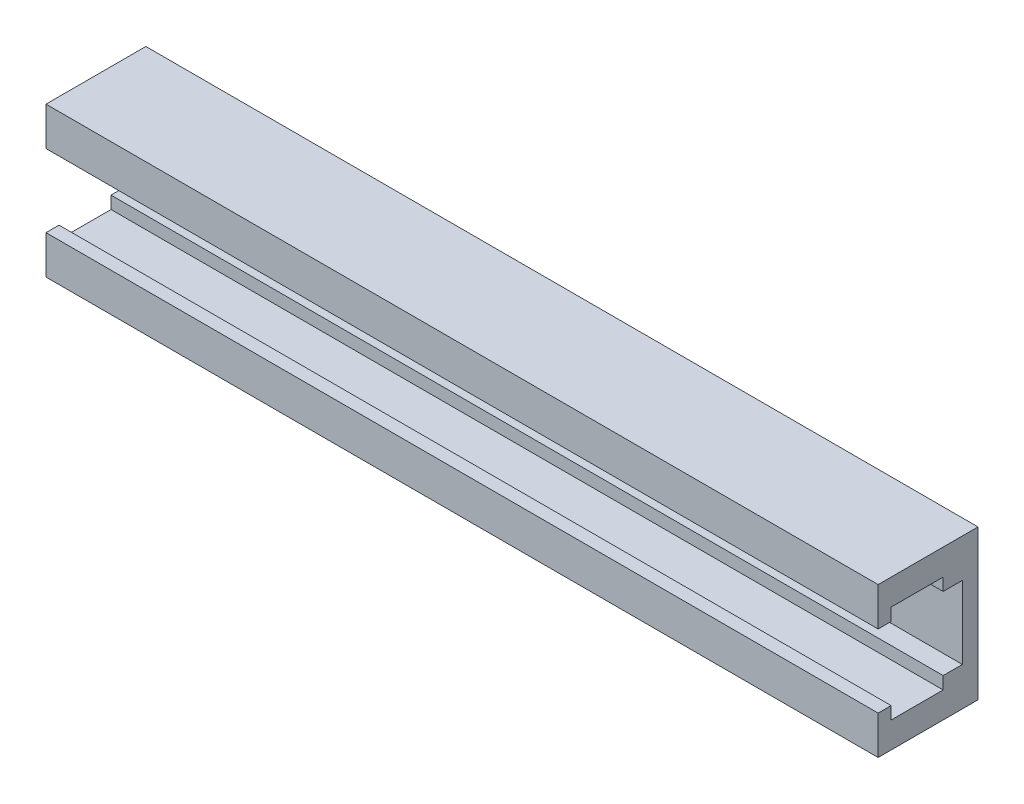
ISO-10303-21;
HEADER;
FILE_DESCRIPTION(('STEP AP214'),'2;1');
FILE_NAME('part.step','',(''),(''),'','','');
FILE_SCHEMA(('AUTOMOTIVE_DESIGN { 1 0 10303 214 1 1 1 1 }'));
ENDSEC;
DATA;
#1=APPLICATION_CONTEXT('core data for automotive mechanical design processes');
#2=APPLICATION_PROTOCOL_DEFINITION('international standard','automotive_design',2000,#1);
#3=PRODUCT_CONTEXT('',#1,'mechanical');
#4=PRODUCT('Part','Part','',(#3));
#5=PRODUCT_RELATED_PRODUCT_CATEGORY('part','',(#4));
#6=PRODUCT_DEFINITION_FORMATION('','',#4);
#7=PRODUCT_DEFINITION_CONTEXT('part definition',#1,'design');
#8=PRODUCT_DEFINITION('design','',#6,#7);
#9=PRODUCT_DEFINITION_SHAPE('','',#8);
#10=(LENGTH_UNIT() NAMED_UNIT(*) SI_UNIT(.MILLI.,.METRE.));
#11=(NAMED_UNIT(*) PLANE_ANGLE_UNIT() SI_UNIT($,.RADIAN.));
#12=(NAMED_UNIT(*) SI_UNIT($,.STERADIAN.) SOLID_ANGLE_UNIT());
#13=UNCERTAINTY_MEASURE_WITH_UNIT(LENGTH_MEASURE(1.E-05),#10,'distance_accuracy_value','');
#14=(GEOMETRIC_REPRESENTATION_CONTEXT(3) GLOBAL_UNCERTAINTY_ASSIGNED_CONTEXT((#13)) GLOBAL_UNIT_ASSIGNED_CONTEXT((#10,
#11,#12)) REPRESENTATION_CONTEXT('',''));
#15=CARTESIAN_POINT('',(0.,0.,0.));
#16=DIRECTION('',(0.,0.,1.));
#17=DIRECTION('',(1.,0.,0.));
#18=AXIS2_PLACEMENT_3D('',#15,#16,#17);
#19=CARTESIAN_POINT('',(50.8,-9.144,0.));
#20=DIRECTION('',(0.,0.,1.));
#21=DIRECTION('',(0.,-1.,0.));
#22=AXIS2_PLACEMENT_3D('',#19,#20,#21);
#23=PLANE('',#22);
#24=CARTESIAN_POINT('',(38.1,0.,0.));
#25=DIRECTION('',(0.,0.,1.));
#26=DIRECTION('',(0.,-1.,0.));
#27=AXIS2_PLACEMENT_3D('',#24,#25,#26);
#28=CIRCLE('',#27,2.413);
#29=CARTESIAN_POINT('',(38.1,-2.413,0.));
#30=VERTEX_POINT('',#29);
#31=EDGE_CURVE('E240',#30,#30,#28,.F.);
#32=ORIENTED_EDGE('',*,*,#31,.F.);
#33=EDGE_LOOP('',(#32));
#34=FACE_BOUND('',#33,.T.);
#35=DIRECTION('',(-1.,0.,0.));
#36=VECTOR('',#35,1.);
#37=CARTESIAN_POINT('',(50.8,-9.144,0.));
#38=LINE('',#37,#36);
#39=CARTESIAN_POINT('',(50.8,-9.144,0.));
#40=VERTEX_POINT('',#39);
#41=CARTESIAN_POINT('',(-50.8,-9.144,0.));
#42=VERTEX_POINT('',#41);
#43=EDGE_CURVE('E172',#40,#42,#38,.T.);
#44=ORIENTED_EDGE('',*,*,#43,.T.);
#45=DIRECTION('',(0.,1.,0.));
#46=VECTOR('',#45,1.);
#47=CARTESIAN_POINT('',(-50.8,-9.144,0.));
#48=LINE('',#47,#46);
#49=CARTESIAN_POINT('',(-50.8,9.144,0.));
#50=VERTEX_POINT('',#49);
#51=EDGE_CURVE('E165',#42,#50,#48,.T.);
#52=ORIENTED_EDGE('',*,*,#51,.T.);
#53=DIRECTION('',(-1.,0.,0.));
#54=VECTOR('',#53,1.);
#55=CARTESIAN_POINT('',(50.8,9.144,0.));
#56=LINE('',#55,#54);
#57=CARTESIAN_POINT('',(50.8,9.144,0.));
#58=VERTEX_POINT('',#57);
#59=EDGE_CURVE('E12',#58,#50,#56,.T.);
#60=ORIENTED_EDGE('',*,*,#59,.F.);
#61=DIRECTION('',(0.,1.,0.));
#62=VECTOR('',#61,1.);
#63=CARTESIAN_POINT('',(50.8,-9.144,0.));
#64=LINE('',#63,#62);
#65=EDGE_CURVE('E244',#40,#58,#64,.T.);
#66=ORIENTED_EDGE('',*,*,#65,.F.);
#67=EDGE_LOOP('',(#44,#52,#60,#66));
#68=FACE_BOUND('',#67,.T.);
#69=CARTESIAN_POINT('',(-38.1,0.,0.));
#70=DIRECTION('',(0.,0.,-1.));
#71=DIRECTION('',(0.,-1.,0.));
#72=AXIS2_PLACEMENT_3D('',#69,#70,#71);
#73=CIRCLE('',#72,2.413);
#74=CARTESIAN_POINT('',(-38.1,-2.413,0.));
#75=VERTEX_POINT('',#74);
#76=EDGE_CURVE('E175',#75,#75,#73,.F.);
#77=ORIENTED_EDGE('',*,*,#76,.T.);
#78=EDGE_LOOP('',(#77));
#79=FACE_BOUND('',#78,.T.);
#80=ADVANCED_FACE('F40',(#34,#68,#79),#23,.F.);
#81=CARTESIAN_POINT('',(50.8,9.144,0.));
#82=DIRECTION('',(0.,-1.,0.));
#83=DIRECTION('',(0.,0.,-1.));
#84=AXIS2_PLACEMENT_3D('',#81,#82,#83);
#85=PLANE('',#84);
#86=ORIENTED_EDGE('',*,*,#59,.T.);
#87=DIRECTION('',(0.,0.,1.));
#88=VECTOR('',#87,1.);
#89=CARTESIAN_POINT('',(-50.8,9.144,0.));
#90=LINE('',#89,#88);
#91=CARTESIAN_POINT('',(-50.8,9.144,12.192));
#92=VERTEX_POINT('',#91);
#93=EDGE_CURVE('E155',#50,#92,#90,.T.);
#94=ORIENTED_EDGE('',*,*,#93,.T.);
#95=DIRECTION('',(-1.,0.,0.));
#96=VECTOR('',#95,1.);
#97=CARTESIAN_POINT('',(50.8,9.144,12.192));
#98=LINE('',#97,#96);
#99=CARTESIAN_POINT('',(50.8,9.144,12.192));
#100=VERTEX_POINT('',#99);
#101=EDGE_CURVE('E48',#100,#92,#98,.T.);
#102=ORIENTED_EDGE('',*,*,#101,.F.);
#103=DIRECTION('',(0.,0.,1.));
#104=VECTOR('',#103,1.);
#105=CARTESIAN_POINT('',(50.8,9.144,0.));
#106=LINE('',#105,#104);
#107=EDGE_CURVE('E156',#58,#100,#106,.T.);
#108=ORIENTED_EDGE('',*,*,#107,.F.);
#109=EDGE_LOOP('',(#86,#94,#102,#108));
#110=FACE_BOUND('',#109,.T.);
#111=ADVANCED_FACE('F153',(#110),#85,.F.);
#112=CARTESIAN_POINT('',(50.8,9.144,12.192));
#113=DIRECTION('',(0.,0.,-1.));
#114=DIRECTION('',(0.,1.,0.));
#115=AXIS2_PLACEMENT_3D('',#112,#113,#114);
#116=PLANE('',#115);
#117=ORIENTED_EDGE('',*,*,#101,.T.);
#118=DIRECTION('',(0.,-1.,0.));
#119=VECTOR('',#118,1.);
#120=CARTESIAN_POINT('',(-50.8,9.144,12.192));
#121=LINE('',#120,#119);
#122=CARTESIAN_POINT('',(-50.8,4.445,12.192));
#123=VERTEX_POINT('',#122);
#124=EDGE_CURVE('E168',#92,#123,#121,.T.);
#125=ORIENTED_EDGE('',*,*,#124,.T.);
#126=DIRECTION('',(-1.,0.,0.));
#127=VECTOR('',#126,1.);
#128=CARTESIAN_POINT('',(50.8,4.445,12.192));
#129=LINE('',#128,#127);
#130=CARTESIAN_POINT('',(50.8,4.445,12.192));
#131=VERTEX_POINT('',#130);
#132=EDGE_CURVE('E327',#131,#123,#129,.T.);
#133=ORIENTED_EDGE('',*,*,#132,.F.);
#134=DIRECTION('',(0.,-1.,0.));
#135=VECTOR('',#134,1.);
#136=CARTESIAN_POINT('',(50.8,9.144,12.192));
#137=LINE('',#136,#135);
#138=EDGE_CURVE('E249',#100,#131,#137,.T.);
#139=ORIENTED_EDGE('',*,*,#138,.F.);
#140=EDGE_LOOP('',(#117,#125,#133,#139));
#141=FACE_BOUND('',#140,.T.);
#142=ADVANCED_FACE('F332',(#141),#116,.F.);
#143=CARTESIAN_POINT('',(50.8,4.445,12.192));
#144=DIRECTION('',(0.,1.,0.));
#145=DIRECTION('',(0.,0.,1.));
#146=AXIS2_PLACEMENT_3D('',#143,#144,#145);
#147=PLANE('',#146);
#148=ORIENTED_EDGE('',*,*,#132,.T.);
#149=DIRECTION('',(0.,0.,-1.));
#150=VECTOR('',#149,1.);
#151=CARTESIAN_POINT('',(-50.8,4.445,12.192));
#152=LINE('',#151,#150);
#153=CARTESIAN_POINT('',(-50.8,4.445,10.6045));
#154=VERTEX_POINT('',#153);
#155=EDGE_CURVE('E185',#123,#154,#152,.T.);
#156=ORIENTED_EDGE('',*,*,#155,.T.);
#157=DIRECTION('',(-1.,0.,0.));
#158=VECTOR('',#157,1.);
#159=CARTESIAN_POINT('',(50.8,4.445,10.6045));
#160=LINE('',#159,#158);
#161=CARTESIAN_POINT('',(50.8,4.445,10.6045));
#162=VERTEX_POINT('',#161);
#163=EDGE_CURVE('E324',#162,#154,#160,.T.);
#164=ORIENTED_EDGE('',*,*,#163,.F.);
#165=DIRECTION('',(0.,0.,-1.));
#166=VECTOR('',#165,1.);
#167=CARTESIAN_POINT('',(50.8,4.445,12.192));
#168=LINE('',#167,#166);
#169=EDGE_CURVE('E252',#131,#162,#168,.T.);
#170=ORIENTED_EDGE('',*,*,#169,.F.);
#171=EDGE_LOOP('',(#148,#156,#164,#170));
#172=FACE_BOUND('',#171,.T.);
#173=ADVANCED_FACE('F340',(#172),#147,.F.);
#174=CARTESIAN_POINT('',(50.8,4.445,10.6045));
#175=DIRECTION('',(0.,0.,1.));
#176=DIRECTION('',(1.,0.,0.));
#177=AXIS2_PLACEMENT_3D('',#174,#175,#176);
#178=PLANE('',#177);
#179=ORIENTED_EDGE('',*,*,#163,.T.);
#180=DIRECTION('',(0.,1.,0.));
#181=VECTOR('',#180,1.);
#182=CARTESIAN_POINT('',(-50.8,4.445,10.6045));
#183=LINE('',#182,#181);
#184=CARTESIAN_POINT('',(-50.8,5.969,10.6045));
#185=VERTEX_POINT('',#184);
#186=EDGE_CURVE('E189',#154,#185,#183,.T.);
#187=ORIENTED_EDGE('',*,*,#186,.T.);
#188=DIRECTION('',(-1.,0.,0.));
#189=VECTOR('',#188,1.);
#190=CARTESIAN_POINT('',(50.8,5.969,10.6045));
#191=LINE('',#190,#189);
#192=CARTESIAN_POINT('',(50.8,5.969,10.6045));
#193=VERTEX_POINT('',#192);
#194=EDGE_CURVE('E321',#193,#185,#191,.T.);
#195=ORIENTED_EDGE('',*,*,#194,.F.);
#196=DIRECTION('',(0.,1.,0.));
#197=VECTOR('',#196,1.);
#198=CARTESIAN_POINT('',(50.8,4.445,10.6045));
#199=LINE('',#198,#197);
#200=EDGE_CURVE('E255',#162,#193,#199,.T.);
#201=ORIENTED_EDGE('',*,*,#200,.F.);
#202=EDGE_LOOP('',(#179,#187,#195,#201));
#203=FACE_BOUND('',#202,.T.);
#204=ADVANCED_FACE('F343',(#203),#178,.F.);
#205=CARTESIAN_POINT('',(50.8,5.969,10.6045));
#206=DIRECTION('',(0.,1.,0.));
#207=DIRECTION('',(0.,0.,1.));
#208=AXIS2_PLACEMENT_3D('',#205,#206,#207);
#209=PLANE('',#208);
#210=ORIENTED_EDGE('',*,*,#194,.T.);
#211=DIRECTION('',(0.,0.,-1.));
#212=VECTOR('',#211,1.);
#213=CARTESIAN_POINT('',(-50.8,5.969,10.6045));
#214=LINE('',#213,#212);
#215=CARTESIAN_POINT('',(-50.8,5.969,4.2545));
#216=VERTEX_POINT('',#215);
#217=EDGE_CURVE('E193',#185,#216,#214,.T.);
#218=ORIENTED_EDGE('',*,*,#217,.T.);
#219=DIRECTION('',(-1.,0.,0.));
#220=VECTOR('',#219,1.);
#221=CARTESIAN_POINT('',(50.8,5.969,4.2545));
#222=LINE('',#221,#220);
#223=CARTESIAN_POINT('',(50.8,5.969,4.2545));
#224=VERTEX_POINT('',#223);
#225=EDGE_CURVE('E318',#224,#216,#222,.T.);
#226=ORIENTED_EDGE('',*,*,#225,.F.);
#227=DIRECTION('',(0.,0.,-1.));
#228=VECTOR('',#227,1.);
#229=CARTESIAN_POINT('',(50.8,5.969,10.6045));
#230=LINE('',#229,#228);
#231=EDGE_CURVE('E258',#193,#224,#230,.T.);
#232=ORIENTED_EDGE('',*,*,#231,.F.);
#233=EDGE_LOOP('',(#210,#218,#226,#232));
#234=FACE_BOUND('',#233,.T.);
#235=ADVANCED_FACE('F348',(#234),#209,.F.);
#236=CARTESIAN_POINT('',(50.8,5.969,4.2545));
#237=DIRECTION('',(0.,0.,-1.));
#238=DIRECTION('',(-1.,0.,0.));
#239=AXIS2_PLACEMENT_3D('',#236,#237,#238);
#240=PLANE('',#239);
#241=ORIENTED_EDGE('',*,*,#225,.T.);
#242=DIRECTION('',(0.,-1.,0.));
#243=VECTOR('',#242,1.);
#244=CARTESIAN_POINT('',(-50.8,5.969,4.2545));
#245=LINE('',#244,#243);
#246=CARTESIAN_POINT('',(-50.8,4.445,4.2545));
#247=VERTEX_POINT('',#246);
#248=EDGE_CURVE('E197',#216,#247,#245,.T.);
#249=ORIENTED_EDGE('',*,*,#248,.T.);
#250=DIRECTION('',(-1.,0.,0.));
#251=VECTOR('',#250,1.);
#252=CARTESIAN_POINT('',(50.8,4.445,4.2545));
#253=LINE('',#252,#251);
#254=CARTESIAN_POINT('',(50.8,4.445,4.2545));
#255=VERTEX_POINT('',#254);
#256=EDGE_CURVE('E315',#255,#247,#253,.T.);
#257=ORIENTED_EDGE('',*,*,#256,.F.);
#258=DIRECTION('',(0.,-1.,0.));
#259=VECTOR('',#258,1.);
#260=CARTESIAN_POINT('',(50.8,5.969,4.2545));
#261=LINE('',#260,#259);
#262=EDGE_CURVE('E261',#224,#255,#261,.T.);
#263=ORIENTED_EDGE('',*,*,#262,.F.);
#264=EDGE_LOOP('',(#241,#249,#257,#263));
#265=FACE_BOUND('',#264,.T.);
#266=ADVANCED_FACE('F354',(#265),#240,.F.);
#267=CARTESIAN_POINT('',(50.8,4.445,4.2545));
#268=DIRECTION('',(0.,1.,0.));
#269=DIRECTION('',(0.,0.,1.));
#270=AXIS2_PLACEMENT_3D('',#267,#268,#269);
#271=PLANE('',#270);
#272=ORIENTED_EDGE('',*,*,#256,.T.);
#273=DIRECTION('',(0.,0.,-1.));
#274=VECTOR('',#273,1.);
#275=CARTESIAN_POINT('',(-50.8,4.445,4.2545));
#276=LINE('',#275,#274);
#277=CARTESIAN_POINT('',(-50.8,4.445,1.905));
#278=VERTEX_POINT('',#277);
#279=EDGE_CURVE('E201',#247,#278,#276,.T.);
#280=ORIENTED_EDGE('',*,*,#279,.T.);
#281=DIRECTION('',(-1.,0.,0.));
#282=VECTOR('',#281,1.);
#283=CARTESIAN_POINT('',(50.8,4.445,1.905));
#284=LINE('',#283,#282);
#285=CARTESIAN_POINT('',(50.8,4.445,1.905));
#286=VERTEX_POINT('',#285);
#287=EDGE_CURVE('E312',#286,#278,#284,.T.);
#288=ORIENTED_EDGE('',*,*,#287,.F.);
#289=DIRECTION('',(0.,0.,-1.));
#290=VECTOR('',#289,1.);
#291=CARTESIAN_POINT('',(50.8,4.445,4.2545));
#292=LINE('',#291,#290);
#293=EDGE_CURVE('E264',#255,#286,#292,.T.);
#294=ORIENTED_EDGE('',*,*,#293,.F.);
#295=EDGE_LOOP('',(#272,#280,#288,#294));
#296=FACE_BOUND('',#295,.T.);
#297=ADVANCED_FACE('F358',(#296),#271,.F.);
#298=CARTESIAN_POINT('',(50.8,4.445,1.905));
#299=DIRECTION('',(0.,0.,-1.));
#300=DIRECTION('',(0.,1.,0.));
#301=AXIS2_PLACEMENT_3D('',#298,#299,#300);
#302=PLANE('',#301);
#303=CARTESIAN_POINT('',(38.1,0.,1.905));
#304=DIRECTION('',(0.,0.,1.));
#305=DIRECTION('',(1.,0.,0.));
#306=AXIS2_PLACEMENT_3D('',#303,#304,#305);
#307=CIRCLE('',#306,2.413);
#308=CARTESIAN_POINT('',(40.513,0.,1.905));
#309=VERTEX_POINT('',#308);
#310=EDGE_CURVE('E236',#309,#309,#307,.T.);
#311=ORIENTED_EDGE('',*,*,#310,.F.);
#312=EDGE_LOOP('',(#311));
#313=FACE_BOUND('',#312,.T.);
#314=ORIENTED_EDGE('',*,*,#287,.T.);
#315=DIRECTION('',(0.,-1.,0.));
#316=VECTOR('',#315,1.);
#317=CARTESIAN_POINT('',(-50.8,4.445,1.905));
#318=LINE('',#317,#316);
#319=CARTESIAN_POINT('',(-50.8,-4.445,1.905));
#320=VERTEX_POINT('',#319);
#321=EDGE_CURVE('E205',#278,#320,#318,.T.);
#322=ORIENTED_EDGE('',*,*,#321,.T.);
#323=DIRECTION('',(-1.,0.,0.));
#324=VECTOR('',#323,1.);
#325=CARTESIAN_POINT('',(50.8,-4.445,1.905));
#326=LINE('',#325,#324);
#327=CARTESIAN_POINT('',(50.8,-4.445,1.905));
#328=VERTEX_POINT('',#327);
#329=EDGE_CURVE('E309',#328,#320,#326,.T.);
#330=ORIENTED_EDGE('',*,*,#329,.F.);
#331=DIRECTION('',(0.,-1.,0.));
#332=VECTOR('',#331,1.);
#333=CARTESIAN_POINT('',(50.8,4.445,1.905));
#334=LINE('',#333,#332);
#335=EDGE_CURVE('E267',#286,#328,#334,.T.);
#336=ORIENTED_EDGE('',*,*,#335,.F.);
#337=EDGE_LOOP('',(#314,#322,#330,#336));
#338=FACE_BOUND('',#337,.T.);
#339=CARTESIAN_POINT('',(-38.1,0.,1.905));
#340=DIRECTION('',(0.,0.,-1.));
#341=DIRECTION('',(-1.,0.,0.));
#342=AXIS2_PLACEMENT_3D('',#339,#340,#341);
#343=CIRCLE('',#342,2.413);
#344=CARTESIAN_POINT('',(-40.513,0.,1.905));
#345=VERTEX_POINT('',#344);
#346=EDGE_CURVE('E179',#345,#345,#343,.T.);
#347=ORIENTED_EDGE('',*,*,#346,.T.);
#348=EDGE_LOOP('',(#347));
#349=FACE_BOUND('',#348,.T.);
#350=ADVANCED_FACE('F363',(#313,#338,#349),#302,.F.);
#351=CARTESIAN_POINT('',(50.8,-4.445,1.905));
#352=DIRECTION('',(0.,-1.,0.));
#353=DIRECTION('',(0.,0.,-1.));
#354=AXIS2_PLACEMENT_3D('',#351,#352,#353);
#355=PLANE('',#354);
#356=ORIENTED_EDGE('',*,*,#329,.T.);
#357=DIRECTION('',(0.,0.,1.));
#358=VECTOR('',#357,1.);
#359=CARTESIAN_POINT('',(-50.8,-4.445,1.905));
#360=LINE('',#359,#358);
#361=CARTESIAN_POINT('',(-50.8,-4.445,4.2545));
#362=VERTEX_POINT('',#361);
#363=EDGE_CURVE('E209',#320,#362,#360,.T.);
#364=ORIENTED_EDGE('',*,*,#363,.T.);
#365=DIRECTION('',(-1.,0.,0.));
#366=VECTOR('',#365,1.);
#367=CARTESIAN_POINT('',(50.8,-4.445,4.2545));
#368=LINE('',#367,#366);
#369=CARTESIAN_POINT('',(50.8,-4.445,4.2545));
#370=VERTEX_POINT('',#369);
#371=EDGE_CURVE('E306',#370,#362,#368,.T.);
#372=ORIENTED_EDGE('',*,*,#371,.F.);
#373=DIRECTION('',(0.,0.,1.));
#374=VECTOR('',#373,1.);
#375=CARTESIAN_POINT('',(50.8,-4.445,1.905));
#376=LINE('',#375,#374);
#377=EDGE_CURVE('E270',#328,#370,#376,.T.);
#378=ORIENTED_EDGE('',*,*,#377,.F.);
#379=EDGE_LOOP('',(#356,#364,#372,#378));
#380=FACE_BOUND('',#379,.T.);
#381=ADVANCED_FACE('F370',(#380),#355,.F.);
#382=CARTESIAN_POINT('',(50.8,-4.445,4.2545));
#383=DIRECTION('',(0.,0.,-1.));
#384=DIRECTION('',(0.,1.,0.));
#385=AXIS2_PLACEMENT_3D('',#382,#383,#384);
#386=PLANE('',#385);
#387=ORIENTED_EDGE('',*,*,#371,.T.);
#388=DIRECTION('',(0.,-1.,0.));
#389=VECTOR('',#388,1.);
#390=CARTESIAN_POINT('',(-50.8,-4.445,4.2545));
#391=LINE('',#390,#389);
#392=CARTESIAN_POINT('',(-50.8,-5.969,4.2545));
#393=VERTEX_POINT('',#392);
#394=EDGE_CURVE('E213',#362,#393,#391,.T.);
#395=ORIENTED_EDGE('',*,*,#394,.T.);
#396=DIRECTION('',(-1.,0.,0.));
#397=VECTOR('',#396,1.);
#398=CARTESIAN_POINT('',(50.8,-5.969,4.2545));
#399=LINE('',#398,#397);
#400=CARTESIAN_POINT('',(50.8,-5.969,4.2545));
#401=VERTEX_POINT('',#400);
#402=EDGE_CURVE('E303',#401,#393,#399,.T.);
#403=ORIENTED_EDGE('',*,*,#402,.F.);
#404=DIRECTION('',(0.,-1.,0.));
#405=VECTOR('',#404,1.);
#406=CARTESIAN_POINT('',(50.8,-4.445,4.2545));
#407=LINE('',#406,#405);
#408=EDGE_CURVE('E273',#370,#401,#407,.T.);
#409=ORIENTED_EDGE('',*,*,#408,.F.);
#410=EDGE_LOOP('',(#387,#395,#403,#409));
#411=FACE_BOUND('',#410,.T.);
#412=ADVANCED_FACE('F374',(#411),#386,.F.);
#413=CARTESIAN_POINT('',(50.8,-5.969,4.2545));
#414=DIRECTION('',(0.,-1.,0.));
#415=DIRECTION('',(0.,0.,-1.));
#416=AXIS2_PLACEMENT_3D('',#413,#414,#415);
#417=PLANE('',#416);
#418=ORIENTED_EDGE('',*,*,#402,.T.);
#419=DIRECTION('',(0.,0.,1.));
#420=VECTOR('',#419,1.);
#421=CARTESIAN_POINT('',(-50.8,-5.969,4.2545));
#422=LINE('',#421,#420);
#423=CARTESIAN_POINT('',(-50.8,-5.969,10.6045));
#424=VERTEX_POINT('',#423);
#425=EDGE_CURVE('E217',#393,#424,#422,.T.);
#426=ORIENTED_EDGE('',*,*,#425,.T.);
#427=DIRECTION('',(-1.,0.,0.));
#428=VECTOR('',#427,1.);
#429=CARTESIAN_POINT('',(50.8,-5.969,10.6045));
#430=LINE('',#429,#428);
#431=CARTESIAN_POINT('',(50.8,-5.969,10.6045));
#432=VERTEX_POINT('',#431);
#433=EDGE_CURVE('E300',#432,#424,#430,.T.);
#434=ORIENTED_EDGE('',*,*,#433,.F.);
#435=DIRECTION('',(0.,0.,1.));
#436=VECTOR('',#435,1.);
#437=CARTESIAN_POINT('',(50.8,-5.969,4.2545));
#438=LINE('',#437,#436);
#439=EDGE_CURVE('E276',#401,#432,#438,.T.);
#440=ORIENTED_EDGE('',*,*,#439,.F.);
#441=EDGE_LOOP('',(#418,#426,#434,#440));
#442=FACE_BOUND('',#441,.T.);
#443=ADVANCED_FACE('F379',(#442),#417,.F.);
#444=CARTESIAN_POINT('',(50.8,-5.969,10.6045));
#445=DIRECTION('',(0.,0.,1.));
#446=DIRECTION('',(1.,0.,0.));
#447=AXIS2_PLACEMENT_3D('',#444,#445,#446);
#448=PLANE('',#447);
#449=ORIENTED_EDGE('',*,*,#433,.T.);
#450=DIRECTION('',(0.,1.,0.));
#451=VECTOR('',#450,1.);
#452=CARTESIAN_POINT('',(-50.8,-5.969,10.6045));
#453=LINE('',#452,#451);
#454=CARTESIAN_POINT('',(-50.8,-4.445,10.6045));
#455=VERTEX_POINT('',#454);
#456=EDGE_CURVE('E221',#424,#455,#453,.T.);
#457=ORIENTED_EDGE('',*,*,#456,.T.);
#458=DIRECTION('',(-1.,0.,0.));
#459=VECTOR('',#458,1.);
#460=CARTESIAN_POINT('',(50.8,-4.445,10.6045));
#461=LINE('',#460,#459);
#462=CARTESIAN_POINT('',(50.8,-4.445,10.6045));
#463=VERTEX_POINT('',#462);
#464=EDGE_CURVE('E297',#463,#455,#461,.T.);
#465=ORIENTED_EDGE('',*,*,#464,.F.);
#466=DIRECTION('',(0.,1.,0.));
#467=VECTOR('',#466,1.);
#468=CARTESIAN_POINT('',(50.8,-5.969,10.6045));
#469=LINE('',#468,#467);
#470=EDGE_CURVE('E279',#432,#463,#469,.T.);
#471=ORIENTED_EDGE('',*,*,#470,.F.);
#472=EDGE_LOOP('',(#449,#457,#465,#471));
#473=FACE_BOUND('',#472,.T.);
#474=ADVANCED_FACE('F385',(#473),#448,.F.);
#475=CARTESIAN_POINT('',(50.8,-4.445,10.6045));
#476=DIRECTION('',(0.,-1.,0.));
#477=DIRECTION('',(0.,0.,-1.));
#478=AXIS2_PLACEMENT_3D('',#475,#476,#477);
#479=PLANE('',#478);
#480=ORIENTED_EDGE('',*,*,#464,.T.);
#481=DIRECTION('',(0.,0.,1.));
#482=VECTOR('',#481,1.);
#483=CARTESIAN_POINT('',(-50.8,-4.445,10.6045));
#484=LINE('',#483,#482);
#485=CARTESIAN_POINT('',(-50.8,-4.445,12.192));
#486=VERTEX_POINT('',#485);
#487=EDGE_CURVE('E225',#455,#486,#484,.T.);
#488=ORIENTED_EDGE('',*,*,#487,.T.);
#489=DIRECTION('',(-1.,0.,0.));
#490=VECTOR('',#489,1.);
#491=CARTESIAN_POINT('',(50.8,-4.445,12.192));
#492=LINE('',#491,#490);
#493=CARTESIAN_POINT('',(50.8,-4.445,12.192));
#494=VERTEX_POINT('',#493);
#495=EDGE_CURVE('E294',#494,#486,#492,.T.);
#496=ORIENTED_EDGE('',*,*,#495,.F.);
#497=DIRECTION('',(0.,0.,1.));
#498=VECTOR('',#497,1.);
#499=CARTESIAN_POINT('',(50.8,-4.445,10.6045));
#500=LINE('',#499,#498);
#501=EDGE_CURVE('E282',#463,#494,#500,.T.);
#502=ORIENTED_EDGE('',*,*,#501,.F.);
#503=EDGE_LOOP('',(#480,#488,#496,#502));
#504=FACE_BOUND('',#503,.T.);
#505=ADVANCED_FACE('F389',(#504),#479,.F.);
#506=CARTESIAN_POINT('',(50.8,-4.445,12.192));
#507=DIRECTION('',(0.,0.,-1.));
#508=DIRECTION('',(0.,1.,0.));
#509=AXIS2_PLACEMENT_3D('',#506,#507,#508);
#510=PLANE('',#509);
#511=ORIENTED_EDGE('',*,*,#495,.T.);
#512=DIRECTION('',(0.,-1.,0.));
#513=VECTOR('',#512,1.);
#514=CARTESIAN_POINT('',(-50.8,-4.445,12.192));
#515=LINE('',#514,#513);
#516=CARTESIAN_POINT('',(-50.8,-9.14400000000001,12.192));
#517=VERTEX_POINT('',#516);
#518=EDGE_CURVE('E229',#486,#517,#515,.T.);
#519=ORIENTED_EDGE('',*,*,#518,.T.);
#520=DIRECTION('',(-1.,0.,0.));
#521=VECTOR('',#520,1.);
#522=CARTESIAN_POINT('',(50.8,-9.14400000000001,12.192));
#523=LINE('',#522,#521);
#524=CARTESIAN_POINT('',(50.8,-9.14400000000001,12.192));
#525=VERTEX_POINT('',#524);
#526=EDGE_CURVE('E291',#525,#517,#523,.T.);
#527=ORIENTED_EDGE('',*,*,#526,.F.);
#528=DIRECTION('',(0.,-1.,0.));
#529=VECTOR('',#528,1.);
#530=CARTESIAN_POINT('',(50.8,-4.445,12.192));
#531=LINE('',#530,#529);
#532=EDGE_CURVE('E60',#494,#525,#531,.T.);
#533=ORIENTED_EDGE('',*,*,#532,.F.);
#534=EDGE_LOOP('',(#511,#519,#527,#533));
#535=FACE_BOUND('',#534,.T.);
#536=ADVANCED_FACE('F392',(#535),#510,.F.);
#537=CARTESIAN_POINT('',(50.8,-9.14400000000001,12.192));
#538=DIRECTION('',(0.,1.,0.));
#539=DIRECTION('',(0.,0.,1.));
#540=AXIS2_PLACEMENT_3D('',#537,#538,#539);
#541=PLANE('',#540);
#542=ORIENTED_EDGE('',*,*,#526,.T.);
#543=DIRECTION('',(0.,0.,-1.));
#544=VECTOR('',#543,1.);
#545=CARTESIAN_POINT('',(-50.8,-9.14400000000001,12.192));
#546=LINE('',#545,#544);
#547=EDGE_CURVE('E233',#517,#42,#546,.T.);
#548=ORIENTED_EDGE('',*,*,#547,.T.);
#549=ORIENTED_EDGE('',*,*,#43,.F.);
#550=DIRECTION('',(0.,0.,-1.));
#551=VECTOR('',#550,1.);
#552=CARTESIAN_POINT('',(50.8,-9.14400000000001,12.192));
#553=LINE('',#552,#551);
#554=EDGE_CURVE('E55',#525,#40,#553,.T.);
#555=ORIENTED_EDGE('',*,*,#554,.F.);
#556=EDGE_LOOP('',(#542,#548,#549,#555));
#557=FACE_BOUND('',#556,.T.);
#558=ADVANCED_FACE('F394',(#557),#541,.F.);
#559=CARTESIAN_POINT('',(50.8,9.144,0.));
#560=DIRECTION('',(1.,0.,0.));
#561=DIRECTION('',(0.,0.,-1.));
#562=AXIS2_PLACEMENT_3D('',#559,#560,#561);
#563=PLANE('',#562);
#564=ORIENTED_EDGE('',*,*,#65,.T.);
#565=ORIENTED_EDGE('',*,*,#107,.T.);
#566=ORIENTED_EDGE('',*,*,#138,.T.);
#567=ORIENTED_EDGE('',*,*,#169,.T.);
#568=ORIENTED_EDGE('',*,*,#200,.T.);
#569=ORIENTED_EDGE('',*,*,#231,.T.);
#570=ORIENTED_EDGE('',*,*,#262,.T.);
#571=ORIENTED_EDGE('',*,*,#293,.T.);
#572=ORIENTED_EDGE('',*,*,#335,.T.);
#573=ORIENTED_EDGE('',*,*,#377,.T.);
#574=ORIENTED_EDGE('',*,*,#408,.T.);
#575=ORIENTED_EDGE('',*,*,#439,.T.);
#576=ORIENTED_EDGE('',*,*,#470,.T.);
#577=ORIENTED_EDGE('',*,*,#501,.T.);
#578=ORIENTED_EDGE('',*,*,#532,.T.);
#579=ORIENTED_EDGE('',*,*,#554,.T.);
#580=EDGE_LOOP('',(#564,#565,#566,#567,#568,#569,#570,#571,#572,#573,#574,#575,#576,#577,#578,#579));
#581=FACE_BOUND('',#580,.T.);
#582=ADVANCED_FACE('F335',(#581),#563,.T.);
#583=CARTESIAN_POINT('',(38.1,0.,-6.82499465201257));
#584=DIRECTION('',(0.,0.,1.));
#585=DIRECTION('',(1.,0.,0.));
#586=AXIS2_PLACEMENT_3D('',#583,#584,#585);
#587=CYLINDRICAL_SURFACE('',#586,2.413);
#588=ORIENTED_EDGE('',*,*,#31,.T.);
#589=EDGE_LOOP('',(#588));
#590=FACE_BOUND('',#589,.T.);
#591=ORIENTED_EDGE('',*,*,#310,.T.);
#592=EDGE_LOOP('',(#591));
#593=FACE_BOUND('',#592,.T.);
#594=ADVANCED_FACE('F401',(#590,#593),#587,.F.);
#595=CARTESIAN_POINT('',(-50.8,9.144,0.));
#596=DIRECTION('',(-1.,0.,0.));
#597=DIRECTION('',(0.,0.,-1.));
#598=AXIS2_PLACEMENT_3D('',#595,#596,#597);
#599=PLANE('',#598);
#600=ORIENTED_EDGE('',*,*,#51,.F.);
#601=ORIENTED_EDGE('',*,*,#547,.F.);
#602=ORIENTED_EDGE('',*,*,#518,.F.);
#603=ORIENTED_EDGE('',*,*,#487,.F.);
#604=ORIENTED_EDGE('',*,*,#456,.F.);
#605=ORIENTED_EDGE('',*,*,#425,.F.);
#606=ORIENTED_EDGE('',*,*,#394,.F.);
#607=ORIENTED_EDGE('',*,*,#363,.F.);
#608=ORIENTED_EDGE('',*,*,#321,.F.);
#609=ORIENTED_EDGE('',*,*,#279,.F.);
#610=ORIENTED_EDGE('',*,*,#248,.F.);
#611=ORIENTED_EDGE('',*,*,#217,.F.);
#612=ORIENTED_EDGE('',*,*,#186,.F.);
#613=ORIENTED_EDGE('',*,*,#155,.F.);
#614=ORIENTED_EDGE('',*,*,#124,.F.);
#615=ORIENTED_EDGE('',*,*,#93,.F.);
#616=EDGE_LOOP('',(#600,#601,#602,#603,#604,#605,#606,#607,#608,#609,#610,#611,#612,#613,#614,#615));
#617=FACE_BOUND('',#616,.T.);
#618=ADVANCED_FACE('F163',(#617),#599,.T.);
#619=CARTESIAN_POINT('',(-38.1,0.,-6.82499465201257));
#620=DIRECTION('',(0.,0.,1.));
#621=DIRECTION('',(-1.,0.,0.));
#622=AXIS2_PLACEMENT_3D('',#619,#620,#621);
#623=CYLINDRICAL_SURFACE('',#622,2.413);
#624=ORIENTED_EDGE('',*,*,#76,.F.);
#625=EDGE_LOOP('',(#624));
#626=FACE_BOUND('',#625,.T.);
#627=ORIENTED_EDGE('',*,*,#346,.F.);
#628=EDGE_LOOP('',(#627));
#629=FACE_BOUND('',#628,.T.);
#630=ADVANCED_FACE('F528',(#626,#629),#623,.F.);
#631=CLOSED_SHELL('',(#80,#111,#142,#173,#204,#235,#266,#297,#350,#381,#412,#443,#474,#505,#536,
#558,#582,#594,#618,#630));
#632=MANIFOLD_SOLID_BREP('B2',#631);
#633=ADVANCED_BREP_SHAPE_REPRESENTATION('',(#18,#632),#14);
#634=SHAPE_DEFINITION_REPRESENTATION(#9,#633);
ENDSEC;
END-ISO-10303-21;
